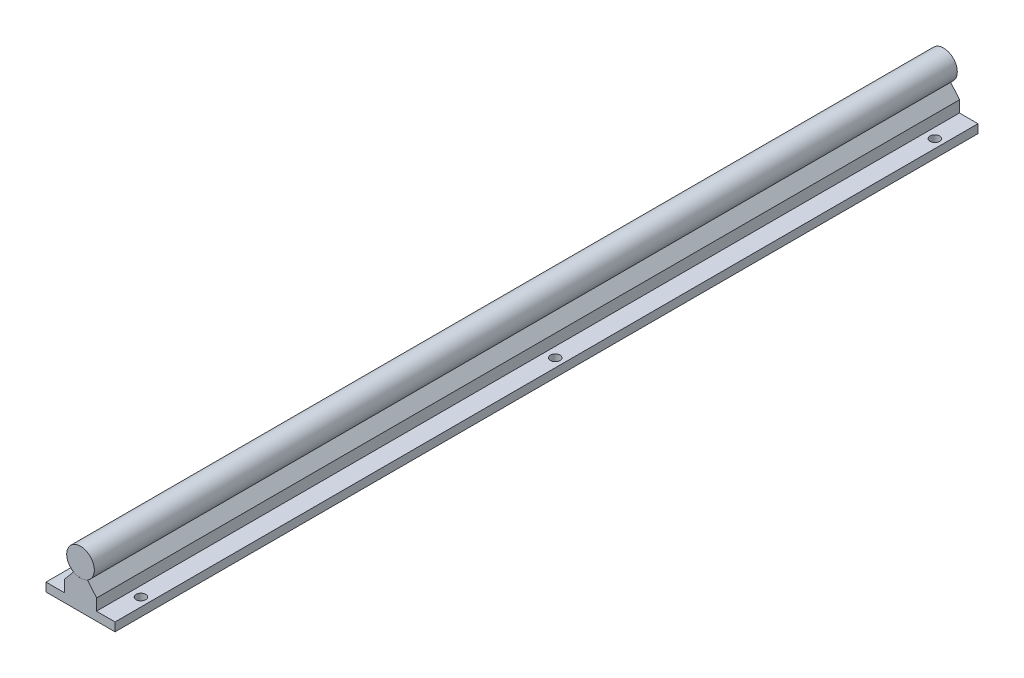
ISO-10303-21;
HEADER;
FILE_DESCRIPTION(('STEP AP214'),'2;1');
FILE_NAME('part.step','',(''),(''),'','','');
FILE_SCHEMA(('AUTOMOTIVE_DESIGN { 1 0 10303 214 1 1 1 1 }'));
ENDSEC;
DATA;
#1=APPLICATION_CONTEXT('core data for automotive mechanical design processes');
#2=APPLICATION_PROTOCOL_DEFINITION('international standard','automotive_design',2000,#1);
#3=PRODUCT_CONTEXT('',#1,'mechanical');
#4=PRODUCT('Part','Part','',(#3));
#5=PRODUCT_RELATED_PRODUCT_CATEGORY('part','',(#4));
#6=PRODUCT_DEFINITION_FORMATION('','',#4);
#7=PRODUCT_DEFINITION_CONTEXT('part definition',#1,'design');
#8=PRODUCT_DEFINITION('design','',#6,#7);
#9=PRODUCT_DEFINITION_SHAPE('','',#8);
#10=(LENGTH_UNIT() NAMED_UNIT(*) SI_UNIT(.MILLI.,.METRE.));
#11=(NAMED_UNIT(*) PLANE_ANGLE_UNIT() SI_UNIT($,.RADIAN.));
#12=(NAMED_UNIT(*) SI_UNIT($,.STERADIAN.) SOLID_ANGLE_UNIT());
#13=UNCERTAINTY_MEASURE_WITH_UNIT(LENGTH_MEASURE(1.E-05),#10,'distance_accuracy_value','');
#14=(GEOMETRIC_REPRESENTATION_CONTEXT(3) GLOBAL_UNCERTAINTY_ASSIGNED_CONTEXT((#13)) GLOBAL_UNIT_ASSIGNED_CONTEXT((#10,
#11,#12)) REPRESENTATION_CONTEXT('',''));
#15=CARTESIAN_POINT('',(0.,0.,0.));
#16=DIRECTION('',(0.,0.,1.));
#17=DIRECTION('',(1.,0.,0.));
#18=AXIS2_PLACEMENT_3D('',#15,#16,#17);
#19=CARTESIAN_POINT('',(1.29091350120477E-13,-1.82545695673485,500.));
#20=DIRECTION('',(0.,0.,-1.));
#21=DIRECTION('',(1.,0.,0.));
#22=AXIS2_PLACEMENT_3D('',#19,#20,#21);
#23=CYLINDRICAL_SURFACE('',#22,8.00000000000048);
#24=CARTESIAN_POINT('',(1.29091350120477E-13,-1.82545695673485,0.));
#25=DIRECTION('',(0.,0.,1.));
#26=DIRECTION('',(-1.,0.,0.));
#27=AXIS2_PLACEMENT_3D('',#24,#25,#26);
#28=CIRCLE('',#27,8.00000000000048);
#29=CARTESIAN_POINT('',(-4.,-8.75366018701084,0.));
#30=VERTEX_POINT('',#29);
#31=CARTESIAN_POINT('',(4.,-8.75366018701084,0.));
#32=VERTEX_POINT('',#31);
#33=EDGE_CURVE('E130',#30,#32,#28,.T.);
#34=ORIENTED_EDGE('',*,*,#33,.F.);
#35=DIRECTION('',(0.,0.,-1.));
#36=VECTOR('',#35,1.);
#37=CARTESIAN_POINT('',(-4.,-8.75366018701084,500.));
#38=LINE('',#37,#36);
#39=CARTESIAN_POINT('',(-4.,-8.75366018701084,500.));
#40=VERTEX_POINT('',#39);
#41=EDGE_CURVE('E129',#40,#30,#38,.T.);
#42=ORIENTED_EDGE('',*,*,#41,.F.);
#43=CARTESIAN_POINT('',(1.29091350120477E-13,-1.82545695673485,500.));
#44=DIRECTION('',(0.,0.,1.));
#45=DIRECTION('',(-1.,0.,0.));
#46=AXIS2_PLACEMENT_3D('',#43,#44,#45);
#47=CIRCLE('',#46,8.00000000000048);
#48=CARTESIAN_POINT('',(4.,-8.75366018701084,500.));
#49=VERTEX_POINT('',#48);
#50=EDGE_CURVE('E146',#40,#49,#47,.T.);
#51=ORIENTED_EDGE('',*,*,#50,.T.);
#52=DIRECTION('',(0.,0.,-1.));
#53=VECTOR('',#52,1.);
#54=CARTESIAN_POINT('',(4.,-8.75366018701084,500.));
#55=LINE('',#54,#53);
#56=EDGE_CURVE('E231',#49,#32,#55,.T.);
#57=ORIENTED_EDGE('',*,*,#56,.T.);
#58=EDGE_LOOP('',(#34,#42,#51,#57));
#59=FACE_BOUND('',#58,.T.);
#60=ADVANCED_FACE('F42',(#59),#23,.F.);
#61=CARTESIAN_POINT('',(-20.,-26.8254569567353,500.));
#62=DIRECTION('',(0.,1.,0.));
#63=DIRECTION('',(1.,0.,0.));
#64=AXIS2_PLACEMENT_3D('',#61,#62,#63);
#65=PLANE('',#64);
#66=CARTESIAN_POINT('',(15.,-26.8254569567353,480.));
#67=DIRECTION('',(0.,-1.,0.));
#68=DIRECTION('',(1.,0.,0.));
#69=AXIS2_PLACEMENT_3D('',#66,#67,#68);
#70=CIRCLE('',#69,2.75);
#71=CARTESIAN_POINT('',(17.75,-26.8254569567353,480.));
#72=VERTEX_POINT('',#71);
#73=EDGE_CURVE('E290',#72,#72,#70,.T.);
#74=ORIENTED_EDGE('',*,*,#73,.F.);
#75=EDGE_LOOP('',(#74));
#76=FACE_BOUND('',#75,.T.);
#77=CARTESIAN_POINT('',(-15.,-26.8254569567353,480.));
#78=DIRECTION('',(0.,-1.,0.));
#79=DIRECTION('',(1.,0.,0.));
#80=AXIS2_PLACEMENT_3D('',#77,#78,#79);
#81=CIRCLE('',#80,2.75);
#82=CARTESIAN_POINT('',(-12.25,-26.8254569567353,480.));
#83=VERTEX_POINT('',#82);
#84=EDGE_CURVE('E284',#83,#83,#81,.T.);
#85=ORIENTED_EDGE('',*,*,#84,.F.);
#86=EDGE_LOOP('',(#85));
#87=FACE_BOUND('',#86,.T.);
#88=CARTESIAN_POINT('',(15.,-26.8254569567353,239.937905991553));
#89=DIRECTION('',(0.,-1.,0.));
#90=DIRECTION('',(1.,0.,0.));
#91=AXIS2_PLACEMENT_3D('',#88,#89,#90);
#92=CIRCLE('',#91,2.75);
#93=CARTESIAN_POINT('',(17.75,-26.8254569567353,239.937905991553));
#94=VERTEX_POINT('',#93);
#95=EDGE_CURVE('E278',#94,#94,#92,.T.);
#96=ORIENTED_EDGE('',*,*,#95,.F.);
#97=EDGE_LOOP('',(#96));
#98=FACE_BOUND('',#97,.T.);
#99=CARTESIAN_POINT('',(-15.,-26.8254569567353,239.937905991553));
#100=DIRECTION('',(0.,-1.,0.));
#101=DIRECTION('',(1.,0.,0.));
#102=AXIS2_PLACEMENT_3D('',#99,#100,#101);
#103=CIRCLE('',#102,2.75);
#104=CARTESIAN_POINT('',(-12.25,-26.8254569567353,239.937905991553));
#105=VERTEX_POINT('',#104);
#106=EDGE_CURVE('E272',#105,#105,#103,.T.);
#107=ORIENTED_EDGE('',*,*,#106,.F.);
#108=EDGE_LOOP('',(#107));
#109=FACE_BOUND('',#108,.T.);
#110=CARTESIAN_POINT('',(15.,-26.8254569567353,20.));
#111=DIRECTION('',(0.,-1.,0.));
#112=DIRECTION('',(1.,0.,0.));
#113=AXIS2_PLACEMENT_3D('',#110,#111,#112);
#114=CIRCLE('',#113,2.75);
#115=CARTESIAN_POINT('',(17.75,-26.8254569567353,20.));
#116=VERTEX_POINT('',#115);
#117=EDGE_CURVE('E266',#116,#116,#114,.T.);
#118=ORIENTED_EDGE('',*,*,#117,.F.);
#119=EDGE_LOOP('',(#118));
#120=FACE_BOUND('',#119,.T.);
#121=CARTESIAN_POINT('',(-15.,-26.8254569567353,20.));
#122=DIRECTION('',(0.,-1.,0.));
#123=DIRECTION('',(1.,0.,0.));
#124=AXIS2_PLACEMENT_3D('',#121,#122,#123);
#125=CIRCLE('',#124,2.75);
#126=CARTESIAN_POINT('',(-12.25,-26.8254569567353,20.));
#127=VERTEX_POINT('',#126);
#128=EDGE_CURVE('E260',#127,#127,#125,.T.);
#129=ORIENTED_EDGE('',*,*,#128,.F.);
#130=EDGE_LOOP('',(#129));
#131=FACE_BOUND('',#130,.T.);
#132=DIRECTION('',(-1.,0.,0.));
#133=VECTOR('',#132,1.);
#134=CARTESIAN_POINT('',(-20.,-26.8254569567353,0.));
#135=LINE('',#134,#133);
#136=CARTESIAN_POINT('',(20.,-26.8254569567353,0.));
#137=VERTEX_POINT('',#136);
#138=CARTESIAN_POINT('',(-20.,-26.8254569567353,0.));
#139=VERTEX_POINT('',#138);
#140=EDGE_CURVE('E132',#137,#139,#135,.T.);
#141=ORIENTED_EDGE('',*,*,#140,.F.);
#142=DIRECTION('',(0.,0.,-1.));
#143=VECTOR('',#142,1.);
#144=CARTESIAN_POINT('',(20.,-26.8254569567353,500.));
#145=LINE('',#144,#143);
#146=CARTESIAN_POINT('',(20.,-26.8254569567353,500.));
#147=VERTEX_POINT('',#146);
#148=EDGE_CURVE('E133',#147,#137,#145,.T.);
#149=ORIENTED_EDGE('',*,*,#148,.F.);
#150=DIRECTION('',(-1.,0.,0.));
#151=VECTOR('',#150,1.);
#152=CARTESIAN_POINT('',(-20.,-26.8254569567353,500.));
#153=LINE('',#152,#151);
#154=CARTESIAN_POINT('',(-20.,-26.8254569567353,500.));
#155=VERTEX_POINT('',#154);
#156=EDGE_CURVE('E184',#147,#155,#153,.T.);
#157=ORIENTED_EDGE('',*,*,#156,.T.);
#158=DIRECTION('',(0.,0.,-1.));
#159=VECTOR('',#158,1.);
#160=CARTESIAN_POINT('',(-20.,-26.8254569567353,500.));
#161=LINE('',#160,#159);
#162=EDGE_CURVE('E12',#155,#139,#161,.T.);
#163=ORIENTED_EDGE('',*,*,#162,.T.);
#164=EDGE_LOOP('',(#141,#149,#157,#163));
#165=FACE_BOUND('',#164,.T.);
#166=ADVANCED_FACE('F164',(#76,#87,#98,#109,#120,#131,#165),#65,.F.);
#167=CARTESIAN_POINT('',(-20.,-21.8254569567353,500.));
#168=DIRECTION('',(1.,0.,0.));
#169=DIRECTION('',(0.,-1.,0.));
#170=AXIS2_PLACEMENT_3D('',#167,#168,#169);
#171=PLANE('',#170);
#172=DIRECTION('',(0.,1.,0.));
#173=VECTOR('',#172,1.);
#174=CARTESIAN_POINT('',(-20.,-21.8254569567353,0.));
#175=LINE('',#174,#173);
#176=CARTESIAN_POINT('',(-20.,-21.8254569567353,0.));
#177=VERTEX_POINT('',#176);
#178=EDGE_CURVE('E136',#139,#177,#175,.T.);
#179=ORIENTED_EDGE('',*,*,#178,.F.);
#180=ORIENTED_EDGE('',*,*,#162,.F.);
#181=DIRECTION('',(0.,1.,0.));
#182=VECTOR('',#181,1.);
#183=CARTESIAN_POINT('',(-20.,-21.8254569567353,500.));
#184=LINE('',#183,#182);
#185=CARTESIAN_POINT('',(-20.,-21.8254569567353,500.));
#186=VERTEX_POINT('',#185);
#187=EDGE_CURVE('E92',#155,#186,#184,.T.);
#188=ORIENTED_EDGE('',*,*,#187,.T.);
#189=DIRECTION('',(0.,0.,-1.));
#190=VECTOR('',#189,1.);
#191=CARTESIAN_POINT('',(-20.,-21.8254569567353,500.));
#192=LINE('',#191,#190);
#193=EDGE_CURVE('E50',#186,#177,#192,.T.);
#194=ORIENTED_EDGE('',*,*,#193,.T.);
#195=EDGE_LOOP('',(#179,#180,#188,#194));
#196=FACE_BOUND('',#195,.T.);
#197=ADVANCED_FACE('F152',(#196),#171,.F.);
#198=CARTESIAN_POINT('',(-9.24999999999999,-21.8254569567353,500.));
#199=DIRECTION('',(0.,-1.,0.));
#200=DIRECTION('',(0.,0.,-1.));
#201=AXIS2_PLACEMENT_3D('',#198,#199,#200);
#202=PLANE('',#201);
#203=CARTESIAN_POINT('',(-15.,-21.8254569567353,480.));
#204=DIRECTION('',(0.,-1.,0.));
#205=DIRECTION('',(1.,0.,0.));
#206=AXIS2_PLACEMENT_3D('',#203,#204,#205);
#207=CIRCLE('',#206,2.75);
#208=CARTESIAN_POINT('',(-12.25,-21.8254569567353,480.));
#209=VERTEX_POINT('',#208);
#210=EDGE_CURVE('E281',#209,#209,#207,.F.);
#211=ORIENTED_EDGE('',*,*,#210,.F.);
#212=EDGE_LOOP('',(#211));
#213=FACE_BOUND('',#212,.T.);
#214=CARTESIAN_POINT('',(-15.,-21.8254569567353,239.937905991553));
#215=DIRECTION('',(0.,-1.,0.));
#216=DIRECTION('',(1.,0.,0.));
#217=AXIS2_PLACEMENT_3D('',#214,#215,#216);
#218=CIRCLE('',#217,2.75);
#219=CARTESIAN_POINT('',(-12.25,-21.8254569567353,239.937905991553));
#220=VERTEX_POINT('',#219);
#221=EDGE_CURVE('E269',#220,#220,#218,.F.);
#222=ORIENTED_EDGE('',*,*,#221,.F.);
#223=EDGE_LOOP('',(#222));
#224=FACE_BOUND('',#223,.T.);
#225=CARTESIAN_POINT('',(-15.,-21.8254569567353,20.));
#226=DIRECTION('',(0.,-1.,0.));
#227=DIRECTION('',(1.,0.,0.));
#228=AXIS2_PLACEMENT_3D('',#225,#226,#227);
#229=CIRCLE('',#228,2.75);
#230=CARTESIAN_POINT('',(-12.25,-21.8254569567353,20.));
#231=VERTEX_POINT('',#230);
#232=EDGE_CURVE('E252',#231,#231,#229,.F.);
#233=ORIENTED_EDGE('',*,*,#232,.F.);
#234=EDGE_LOOP('',(#233));
#235=FACE_BOUND('',#234,.T.);
#236=DIRECTION('',(1.,0.,0.));
#237=VECTOR('',#236,1.);
#238=CARTESIAN_POINT('',(-9.24999999999999,-21.8254569567353,0.));
#239=LINE('',#238,#237);
#240=CARTESIAN_POINT('',(-9.24999999999999,-21.8254569567353,0.));
#241=VERTEX_POINT('',#240);
#242=EDGE_CURVE('E139',#177,#241,#239,.T.);
#243=ORIENTED_EDGE('',*,*,#242,.F.);
#244=ORIENTED_EDGE('',*,*,#193,.F.);
#245=DIRECTION('',(1.,0.,0.));
#246=VECTOR('',#245,1.);
#247=CARTESIAN_POINT('',(-9.24999999999999,-21.8254569567353,500.));
#248=LINE('',#247,#246);
#249=CARTESIAN_POINT('',(-9.24999999999999,-21.8254569567353,500.));
#250=VERTEX_POINT('',#249);
#251=EDGE_CURVE('E123',#186,#250,#248,.T.);
#252=ORIENTED_EDGE('',*,*,#251,.T.);
#253=DIRECTION('',(0.,0.,-1.));
#254=VECTOR('',#253,1.);
#255=CARTESIAN_POINT('',(-9.24999999999999,-21.8254569567353,500.));
#256=LINE('',#255,#254);
#257=EDGE_CURVE('E117',#250,#241,#256,.T.);
#258=ORIENTED_EDGE('',*,*,#257,.T.);
#259=EDGE_LOOP('',(#243,#244,#252,#258));
#260=FACE_BOUND('',#259,.T.);
#261=ADVANCED_FACE('F316',(#213,#224,#235,#260),#202,.F.);
#262=CARTESIAN_POINT('',(-9.25,-15.1254569567353,500.));
#263=DIRECTION('',(1.,0.,0.));
#264=DIRECTION('',(0.,0.,1.));
#265=AXIS2_PLACEMENT_3D('',#262,#263,#264);
#266=PLANE('',#265);
#267=DIRECTION('',(0.,1.,0.));
#268=VECTOR('',#267,1.);
#269=CARTESIAN_POINT('',(-9.25,-15.1254569567353,0.));
#270=LINE('',#269,#268);
#271=CARTESIAN_POINT('',(-9.25,-15.1254569567353,0.));
#272=VERTEX_POINT('',#271);
#273=EDGE_CURVE('E142',#241,#272,#270,.T.);
#274=ORIENTED_EDGE('',*,*,#273,.F.);
#275=ORIENTED_EDGE('',*,*,#257,.F.);
#276=DIRECTION('',(0.,1.,0.));
#277=VECTOR('',#276,1.);
#278=CARTESIAN_POINT('',(-9.25,-15.1254569567353,500.));
#279=LINE('',#278,#277);
#280=CARTESIAN_POINT('',(-9.25,-15.1254569567353,500.));
#281=VERTEX_POINT('',#280);
#282=EDGE_CURVE('E107',#250,#281,#279,.T.);
#283=ORIENTED_EDGE('',*,*,#282,.T.);
#284=DIRECTION('',(0.,0.,-1.));
#285=VECTOR('',#284,1.);
#286=CARTESIAN_POINT('',(-9.25,-15.1254569567353,500.));
#287=LINE('',#286,#285);
#288=EDGE_CURVE('E112',#281,#272,#287,.T.);
#289=ORIENTED_EDGE('',*,*,#288,.T.);
#290=EDGE_LOOP('',(#274,#275,#283,#289));
#291=FACE_BOUND('',#290,.T.);
#292=ADVANCED_FACE('F120',(#291),#266,.F.);
#293=CARTESIAN_POINT('',(-9.34657231941235,-15.1254569567353,500.));
#294=DIRECTION('',(0.,1.,0.));
#295=DIRECTION('',(0.,0.,1.));
#296=AXIS2_PLACEMENT_3D('',#293,#294,#295);
#297=PLANE('',#296);
#298=DIRECTION('',(-1.,0.,0.));
#299=VECTOR('',#298,1.);
#300=CARTESIAN_POINT('',(-9.34657231941235,-15.1254569567353,0.));
#301=LINE('',#300,#299);
#302=CARTESIAN_POINT('',(-9.34657231941235,-15.1254569567353,0.));
#303=VERTEX_POINT('',#302);
#304=EDGE_CURVE('E114',#272,#303,#301,.T.);
#305=ORIENTED_EDGE('',*,*,#304,.F.);
#306=ORIENTED_EDGE('',*,*,#288,.F.);
#307=DIRECTION('',(-1.,0.,0.));
#308=VECTOR('',#307,1.);
#309=CARTESIAN_POINT('',(-9.34657231941235,-15.1254569567353,500.));
#310=LINE('',#309,#308);
#311=CARTESIAN_POINT('',(-9.34657231941235,-15.1254569567353,500.));
#312=VERTEX_POINT('',#311);
#313=EDGE_CURVE('E103',#281,#312,#310,.T.);
#314=ORIENTED_EDGE('',*,*,#313,.T.);
#315=DIRECTION('',(0.,0.,-1.));
#316=VECTOR('',#315,1.);
#317=CARTESIAN_POINT('',(-9.34657231941235,-15.1254569567353,500.));
#318=LINE('',#317,#316);
#319=EDGE_CURVE('E118',#312,#303,#318,.T.);
#320=ORIENTED_EDGE('',*,*,#319,.T.);
#321=EDGE_LOOP('',(#305,#306,#314,#320));
#322=FACE_BOUND('',#321,.T.);
#323=ADVANCED_FACE('F113',(#322),#297,.F.);
#324=CARTESIAN_POINT('',(-4.,-8.75366018701084,500.));
#325=DIRECTION('',(0.766044443118982,-0.642787609686535,0.));
#326=DIRECTION('',(-0.642787609686535,-0.766044443118982,0.));
#327=AXIS2_PLACEMENT_3D('',#324,#325,#326);
#328=PLANE('',#327);
#329=DIRECTION('',(0.642787609686535,0.766044443118982,0.));
#330=VECTOR('',#329,1.);
#331=CARTESIAN_POINT('',(-4.,-8.75366018701084,0.));
#332=LINE('',#331,#330);
#333=EDGE_CURVE('E79',#303,#30,#332,.T.);
#334=ORIENTED_EDGE('',*,*,#333,.F.);
#335=ORIENTED_EDGE('',*,*,#319,.F.);
#336=DIRECTION('',(0.642787609686535,0.766044443118982,0.));
#337=VECTOR('',#336,1.);
#338=CARTESIAN_POINT('',(-4.,-8.75366018701084,500.));
#339=LINE('',#338,#337);
#340=EDGE_CURVE('E58',#312,#40,#339,.T.);
#341=ORIENTED_EDGE('',*,*,#340,.T.);
#342=ORIENTED_EDGE('',*,*,#41,.T.);
#343=EDGE_LOOP('',(#334,#335,#341,#342));
#344=FACE_BOUND('',#343,.T.);
#345=ADVANCED_FACE('F349',(#344),#328,.F.);
#346=CARTESIAN_POINT('',(1.29091350120477E-13,-1.82545695673485,500.));
#347=DIRECTION('',(0.,0.,1.));
#348=DIRECTION('',(-1.,0.,0.));
#349=AXIS2_PLACEMENT_3D('',#346,#347,#348);
#350=PLANE('',#349);
#351=ORIENTED_EDGE('',*,*,#50,.F.);
#352=ORIENTED_EDGE('',*,*,#340,.F.);
#353=ORIENTED_EDGE('',*,*,#313,.F.);
#354=ORIENTED_EDGE('',*,*,#282,.F.);
#355=ORIENTED_EDGE('',*,*,#251,.F.);
#356=ORIENTED_EDGE('',*,*,#187,.F.);
#357=ORIENTED_EDGE('',*,*,#156,.F.);
#358=DIRECTION('',(0.,1.,0.));
#359=VECTOR('',#358,1.);
#360=CARTESIAN_POINT('',(20.,-21.8254569567353,500.));
#361=LINE('',#360,#359);
#362=CARTESIAN_POINT('',(20.,-21.8254569567353,500.));
#363=VERTEX_POINT('',#362);
#364=EDGE_CURVE('E175',#147,#363,#361,.T.);
#365=ORIENTED_EDGE('',*,*,#364,.T.);
#366=DIRECTION('',(-1.,0.,0.));
#367=VECTOR('',#366,1.);
#368=CARTESIAN_POINT('',(9.25,-21.8254569567353,500.));
#369=LINE('',#368,#367);
#370=CARTESIAN_POINT('',(9.25,-21.8254569567353,500.));
#371=VERTEX_POINT('',#370);
#372=EDGE_CURVE('E235',#363,#371,#369,.T.);
#373=ORIENTED_EDGE('',*,*,#372,.T.);
#374=DIRECTION('',(0.,1.,0.));
#375=VECTOR('',#374,1.);
#376=CARTESIAN_POINT('',(9.25,-15.1254569567353,500.));
#377=LINE('',#376,#375);
#378=CARTESIAN_POINT('',(9.25,-15.1254569567353,500.));
#379=VERTEX_POINT('',#378);
#380=EDGE_CURVE('E245',#371,#379,#377,.T.);
#381=ORIENTED_EDGE('',*,*,#380,.T.);
#382=DIRECTION('',(1.,0.,0.));
#383=VECTOR('',#382,1.);
#384=CARTESIAN_POINT('',(9.34657231941235,-15.1254569567353,500.));
#385=LINE('',#384,#383);
#386=CARTESIAN_POINT('',(9.34657231941235,-15.1254569567353,500.));
#387=VERTEX_POINT('',#386);
#388=EDGE_CURVE('E254',#379,#387,#385,.T.);
#389=ORIENTED_EDGE('',*,*,#388,.T.);
#390=DIRECTION('',(-0.642787609686535,0.766044443118982,0.));
#391=VECTOR('',#390,1.);
#392=CARTESIAN_POINT('',(4.,-8.75366018701084,500.));
#393=LINE('',#392,#391);
#394=EDGE_CURVE('E230',#387,#49,#393,.T.);
#395=ORIENTED_EDGE('',*,*,#394,.T.);
#396=EDGE_LOOP('',(#351,#352,#353,#354,#355,#356,#357,#365,#373,#381,#389,#395));
#397=FACE_BOUND('',#396,.T.);
#398=ADVANCED_FACE('F105',(#397),#350,.T.);
#399=CARTESIAN_POINT('',(1.29091350120477E-13,-1.82545695673485,0.));
#400=DIRECTION('',(0.,0.,1.));
#401=DIRECTION('',(-1.,0.,0.));
#402=AXIS2_PLACEMENT_3D('',#399,#400,#401);
#403=PLANE('',#402);
#404=ORIENTED_EDGE('',*,*,#33,.T.);
#405=DIRECTION('',(-0.642787609686535,0.766044443118982,0.));
#406=VECTOR('',#405,1.);
#407=CARTESIAN_POINT('',(4.,-8.75366018701084,0.));
#408=LINE('',#407,#406);
#409=CARTESIAN_POINT('',(9.34657231941235,-15.1254569567353,0.));
#410=VERTEX_POINT('',#409);
#411=EDGE_CURVE('E221',#410,#32,#408,.T.);
#412=ORIENTED_EDGE('',*,*,#411,.F.);
#413=DIRECTION('',(1.,0.,0.));
#414=VECTOR('',#413,1.);
#415=CARTESIAN_POINT('',(9.34657231941235,-15.1254569567353,0.));
#416=LINE('',#415,#414);
#417=CARTESIAN_POINT('',(9.25,-15.1254569567353,0.));
#418=VERTEX_POINT('',#417);
#419=EDGE_CURVE('E211',#418,#410,#416,.T.);
#420=ORIENTED_EDGE('',*,*,#419,.F.);
#421=DIRECTION('',(0.,1.,0.));
#422=VECTOR('',#421,1.);
#423=CARTESIAN_POINT('',(9.25,-15.1254569567353,0.));
#424=LINE('',#423,#422);
#425=CARTESIAN_POINT('',(9.25,-21.8254569567353,0.));
#426=VERTEX_POINT('',#425);
#427=EDGE_CURVE('E222',#426,#418,#424,.T.);
#428=ORIENTED_EDGE('',*,*,#427,.F.);
#429=DIRECTION('',(-1.,0.,0.));
#430=VECTOR('',#429,1.);
#431=CARTESIAN_POINT('',(9.25,-21.8254569567353,0.));
#432=LINE('',#431,#430);
#433=CARTESIAN_POINT('',(20.,-21.8254569567353,0.));
#434=VERTEX_POINT('',#433);
#435=EDGE_CURVE('E248',#434,#426,#432,.T.);
#436=ORIENTED_EDGE('',*,*,#435,.F.);
#437=DIRECTION('',(0.,1.,0.));
#438=VECTOR('',#437,1.);
#439=CARTESIAN_POINT('',(20.,-21.8254569567353,0.));
#440=LINE('',#439,#438);
#441=EDGE_CURVE('E160',#137,#434,#440,.T.);
#442=ORIENTED_EDGE('',*,*,#441,.F.);
#443=ORIENTED_EDGE('',*,*,#140,.T.);
#444=ORIENTED_EDGE('',*,*,#178,.T.);
#445=ORIENTED_EDGE('',*,*,#242,.T.);
#446=ORIENTED_EDGE('',*,*,#273,.T.);
#447=ORIENTED_EDGE('',*,*,#304,.T.);
#448=ORIENTED_EDGE('',*,*,#333,.T.);
#449=EDGE_LOOP('',(#404,#412,#420,#428,#436,#442,#443,#444,#445,#446,#447,#448));
#450=FACE_BOUND('',#449,.T.);
#451=ADVANCED_FACE('F154',(#450),#403,.F.);
#452=CARTESIAN_POINT('',(20.,-21.8254569567353,500.));
#453=DIRECTION('',(-1.,0.,0.));
#454=DIRECTION('',(0.,-1.,0.));
#455=AXIS2_PLACEMENT_3D('',#452,#453,#454);
#456=PLANE('',#455);
#457=ORIENTED_EDGE('',*,*,#441,.T.);
#458=DIRECTION('',(0.,0.,-1.));
#459=VECTOR('',#458,1.);
#460=CARTESIAN_POINT('',(20.,-21.8254569567353,500.));
#461=LINE('',#460,#459);
#462=EDGE_CURVE('E176',#363,#434,#461,.T.);
#463=ORIENTED_EDGE('',*,*,#462,.F.);
#464=ORIENTED_EDGE('',*,*,#364,.F.);
#465=ORIENTED_EDGE('',*,*,#148,.T.);
#466=EDGE_LOOP('',(#457,#463,#464,#465));
#467=FACE_BOUND('',#466,.T.);
#468=ADVANCED_FACE('F171',(#467),#456,.F.);
#469=CARTESIAN_POINT('',(9.25,-21.8254569567353,500.));
#470=DIRECTION('',(0.,-1.,0.));
#471=DIRECTION('',(0.,0.,-1.));
#472=AXIS2_PLACEMENT_3D('',#469,#470,#471);
#473=PLANE('',#472);
#474=CARTESIAN_POINT('',(15.,-21.8254569567353,480.));
#475=DIRECTION('',(0.,-1.,0.));
#476=DIRECTION('',(0.,0.,-1.));
#477=AXIS2_PLACEMENT_3D('',#474,#475,#476);
#478=CIRCLE('',#477,2.75);
#479=CARTESIAN_POINT('',(15.,-21.8254569567353,477.25));
#480=VERTEX_POINT('',#479);
#481=EDGE_CURVE('E287',#480,#480,#478,.F.);
#482=ORIENTED_EDGE('',*,*,#481,.F.);
#483=EDGE_LOOP('',(#482));
#484=FACE_BOUND('',#483,.T.);
#485=CARTESIAN_POINT('',(15.,-21.8254569567353,239.937905991553));
#486=DIRECTION('',(0.,-1.,0.));
#487=DIRECTION('',(0.,0.,-1.));
#488=AXIS2_PLACEMENT_3D('',#485,#486,#487);
#489=CIRCLE('',#488,2.75);
#490=CARTESIAN_POINT('',(15.,-21.8254569567353,237.187905991553));
#491=VERTEX_POINT('',#490);
#492=EDGE_CURVE('E275',#491,#491,#489,.F.);
#493=ORIENTED_EDGE('',*,*,#492,.F.);
#494=EDGE_LOOP('',(#493));
#495=FACE_BOUND('',#494,.T.);
#496=CARTESIAN_POINT('',(15.,-21.8254569567353,20.));
#497=DIRECTION('',(0.,-1.,0.));
#498=DIRECTION('',(0.,0.,-1.));
#499=AXIS2_PLACEMENT_3D('',#496,#497,#498);
#500=CIRCLE('',#499,2.75);
#501=CARTESIAN_POINT('',(15.,-21.8254569567353,17.25));
#502=VERTEX_POINT('',#501);
#503=EDGE_CURVE('E263',#502,#502,#500,.F.);
#504=ORIENTED_EDGE('',*,*,#503,.F.);
#505=EDGE_LOOP('',(#504));
#506=FACE_BOUND('',#505,.T.);
#507=ORIENTED_EDGE('',*,*,#435,.T.);
#508=DIRECTION('',(0.,0.,-1.));
#509=VECTOR('',#508,1.);
#510=CARTESIAN_POINT('',(9.25,-21.8254569567353,500.));
#511=LINE('',#510,#509);
#512=EDGE_CURVE('E178',#371,#426,#511,.T.);
#513=ORIENTED_EDGE('',*,*,#512,.F.);
#514=ORIENTED_EDGE('',*,*,#372,.F.);
#515=ORIENTED_EDGE('',*,*,#462,.T.);
#516=EDGE_LOOP('',(#507,#513,#514,#515));
#517=FACE_BOUND('',#516,.T.);
#518=ADVANCED_FACE('F333',(#484,#495,#506,#517),#473,.F.);
#519=CARTESIAN_POINT('',(9.25,-15.1254569567353,500.));
#520=DIRECTION('',(-1.,0.,0.));
#521=DIRECTION('',(0.,0.,1.));
#522=AXIS2_PLACEMENT_3D('',#519,#520,#521);
#523=PLANE('',#522);
#524=ORIENTED_EDGE('',*,*,#427,.T.);
#525=DIRECTION('',(0.,0.,-1.));
#526=VECTOR('',#525,1.);
#527=CARTESIAN_POINT('',(9.25,-15.1254569567353,500.));
#528=LINE('',#527,#526);
#529=EDGE_CURVE('E218',#379,#418,#528,.T.);
#530=ORIENTED_EDGE('',*,*,#529,.F.);
#531=ORIENTED_EDGE('',*,*,#380,.F.);
#532=ORIENTED_EDGE('',*,*,#512,.T.);
#533=EDGE_LOOP('',(#524,#530,#531,#532));
#534=FACE_BOUND('',#533,.T.);
#535=ADVANCED_FACE('F244',(#534),#523,.F.);
#536=CARTESIAN_POINT('',(9.34657231941235,-15.1254569567353,500.));
#537=DIRECTION('',(0.,1.,0.));
#538=DIRECTION('',(0.,0.,1.));
#539=AXIS2_PLACEMENT_3D('',#536,#537,#538);
#540=PLANE('',#539);
#541=ORIENTED_EDGE('',*,*,#419,.T.);
#542=DIRECTION('',(0.,0.,-1.));
#543=VECTOR('',#542,1.);
#544=CARTESIAN_POINT('',(9.34657231941235,-15.1254569567353,500.));
#545=LINE('',#544,#543);
#546=EDGE_CURVE('E215',#387,#410,#545,.T.);
#547=ORIENTED_EDGE('',*,*,#546,.F.);
#548=ORIENTED_EDGE('',*,*,#388,.F.);
#549=ORIENTED_EDGE('',*,*,#529,.T.);
#550=EDGE_LOOP('',(#541,#547,#548,#549));
#551=FACE_BOUND('',#550,.T.);
#552=ADVANCED_FACE('F213',(#551),#540,.F.);
#553=CARTESIAN_POINT('',(4.,-8.75366018701084,500.));
#554=DIRECTION('',(-0.766044443118982,-0.642787609686535,0.));
#555=DIRECTION('',(0.642787609686535,-0.766044443118982,0.));
#556=AXIS2_PLACEMENT_3D('',#553,#554,#555);
#557=PLANE('',#556);
#558=ORIENTED_EDGE('',*,*,#411,.T.);
#559=ORIENTED_EDGE('',*,*,#56,.F.);
#560=ORIENTED_EDGE('',*,*,#394,.F.);
#561=ORIENTED_EDGE('',*,*,#546,.T.);
#562=EDGE_LOOP('',(#558,#559,#560,#561));
#563=FACE_BOUND('',#562,.T.);
#564=ADVANCED_FACE('F226',(#563),#557,.F.);
#565=CARTESIAN_POINT('',(-15.,6.17554304326466,20.));
#566=DIRECTION('',(0.,-1.,0.));
#567=DIRECTION('',(1.,0.,0.));
#568=AXIS2_PLACEMENT_3D('',#565,#566,#567);
#569=CYLINDRICAL_SURFACE('',#568,2.75);
#570=ORIENTED_EDGE('',*,*,#128,.T.);
#571=EDGE_LOOP('',(#570));
#572=FACE_BOUND('',#571,.T.);
#573=ORIENTED_EDGE('',*,*,#232,.T.);
#574=EDGE_LOOP('',(#573));
#575=FACE_BOUND('',#574,.T.);
#576=ADVANCED_FACE('F309',(#572,#575),#569,.F.);
#577=CARTESIAN_POINT('',(15.,6.17554304326467,20.));
#578=DIRECTION('',(0.,-1.,0.));
#579=DIRECTION('',(1.,0.,0.));
#580=AXIS2_PLACEMENT_3D('',#577,#578,#579);
#581=CYLINDRICAL_SURFACE('',#580,2.75);
#582=ORIENTED_EDGE('',*,*,#117,.T.);
#583=EDGE_LOOP('',(#582));
#584=FACE_BOUND('',#583,.T.);
#585=ORIENTED_EDGE('',*,*,#503,.T.);
#586=EDGE_LOOP('',(#585));
#587=FACE_BOUND('',#586,.T.);
#588=ADVANCED_FACE('F312',(#584,#587),#581,.F.);
#589=CARTESIAN_POINT('',(-15.,6.17554304326466,239.937905991553));
#590=DIRECTION('',(0.,-1.,0.));
#591=DIRECTION('',(1.,0.,0.));
#592=AXIS2_PLACEMENT_3D('',#589,#590,#591);
#593=CYLINDRICAL_SURFACE('',#592,2.75);
#594=ORIENTED_EDGE('',*,*,#106,.T.);
#595=EDGE_LOOP('',(#594));
#596=FACE_BOUND('',#595,.T.);
#597=ORIENTED_EDGE('',*,*,#221,.T.);
#598=EDGE_LOOP('',(#597));
#599=FACE_BOUND('',#598,.T.);
#600=ADVANCED_FACE('F412',(#596,#599),#593,.F.);
#601=CARTESIAN_POINT('',(15.,6.17554304326467,239.937905991553));
#602=DIRECTION('',(0.,-1.,0.));
#603=DIRECTION('',(1.,0.,0.));
#604=AXIS2_PLACEMENT_3D('',#601,#602,#603);
#605=CYLINDRICAL_SURFACE('',#604,2.75);
#606=ORIENTED_EDGE('',*,*,#95,.T.);
#607=EDGE_LOOP('',(#606));
#608=FACE_BOUND('',#607,.T.);
#609=ORIENTED_EDGE('',*,*,#492,.T.);
#610=EDGE_LOOP('',(#609));
#611=FACE_BOUND('',#610,.T.);
#612=ADVANCED_FACE('F420',(#608,#611),#605,.F.);
#613=CARTESIAN_POINT('',(-15.,6.17554304326466,480.));
#614=DIRECTION('',(0.,-1.,0.));
#615=DIRECTION('',(1.,0.,0.));
#616=AXIS2_PLACEMENT_3D('',#613,#614,#615);
#617=CYLINDRICAL_SURFACE('',#616,2.75);
#618=ORIENTED_EDGE('',*,*,#84,.T.);
#619=EDGE_LOOP('',(#618));
#620=FACE_BOUND('',#619,.T.);
#621=ORIENTED_EDGE('',*,*,#210,.T.);
#622=EDGE_LOOP('',(#621));
#623=FACE_BOUND('',#622,.T.);
#624=ADVANCED_FACE('F428',(#620,#623),#617,.F.);
#625=CARTESIAN_POINT('',(15.,6.17554304326467,480.));
#626=DIRECTION('',(0.,-1.,0.));
#627=DIRECTION('',(1.,0.,0.));
#628=AXIS2_PLACEMENT_3D('',#625,#626,#627);
#629=CYLINDRICAL_SURFACE('',#628,2.75);
#630=ORIENTED_EDGE('',*,*,#73,.T.);
#631=EDGE_LOOP('',(#630));
#632=FACE_BOUND('',#631,.T.);
#633=ORIENTED_EDGE('',*,*,#481,.T.);
#634=EDGE_LOOP('',(#633));
#635=FACE_BOUND('',#634,.T.);
#636=ADVANCED_FACE('F294',(#632,#635),#629,.F.);
#637=CLOSED_SHELL('',(#60,#166,#197,#261,#292,#323,#345,#398,#451,#468,#518,#535,#552,#564,#576,
#588,#600,#612,#624,#636));
#638=MANIFOLD_SOLID_BREP('B2',#637);
#639=CARTESIAN_POINT('',(0.,-1.82545695673533,500.));
#640=DIRECTION('',(0.,0.,-1.));
#641=DIRECTION('',(-1.,0.,0.));
#642=AXIS2_PLACEMENT_3D('',#639,#640,#641);
#643=CYLINDRICAL_SURFACE('',#642,8.);
#644=CARTESIAN_POINT('',(0.,-1.82545695673533,500.));
#645=DIRECTION('',(0.,0.,1.));
#646=DIRECTION('',(1.,0.,0.));
#647=AXIS2_PLACEMENT_3D('',#644,#645,#646);
#648=CIRCLE('',#647,8.);
#649=CARTESIAN_POINT('',(8.,-1.82545695673533,500.));
#650=VERTEX_POINT('',#649);
#651=EDGE_CURVE('E41',#650,#650,#648,.T.);
#652=ORIENTED_EDGE('',*,*,#651,.F.);
#653=EDGE_LOOP('',(#652));
#654=FACE_BOUND('',#653,.T.);
#655=CARTESIAN_POINT('',(0.,-1.82545695673533,0.));
#656=DIRECTION('',(0.,0.,1.));
#657=DIRECTION('',(1.,0.,0.));
#658=AXIS2_PLACEMENT_3D('',#655,#656,#657);
#659=CIRCLE('',#658,8.);
#660=CARTESIAN_POINT('',(8.,-1.82545695673533,0.));
#661=VERTEX_POINT('',#660);
#662=EDGE_CURVE('E523',#661,#661,#659,.T.);
#663=ORIENTED_EDGE('',*,*,#662,.T.);
#664=EDGE_LOOP('',(#663));
#665=FACE_BOUND('',#664,.T.);
#666=ADVANCED_FACE('F520',(#654,#665),#643,.T.);
#667=CARTESIAN_POINT('',(0.,-1.82545695673533,500.));
#668=DIRECTION('',(0.,0.,1.));
#669=DIRECTION('',(1.,0.,0.));
#670=AXIS2_PLACEMENT_3D('',#667,#668,#669);
#671=PLANE('',#670);
#672=ORIENTED_EDGE('',*,*,#651,.T.);
#673=EDGE_LOOP('',(#672));
#674=FACE_BOUND('',#673,.T.);
#675=ADVANCED_FACE('F535',(#674),#671,.T.);
#676=CARTESIAN_POINT('',(0.,-1.82545695673533,0.));
#677=DIRECTION('',(0.,0.,1.));
#678=DIRECTION('',(1.,0.,0.));
#679=AXIS2_PLACEMENT_3D('',#676,#677,#678);
#680=PLANE('',#679);
#681=ORIENTED_EDGE('',*,*,#662,.F.);
#682=EDGE_LOOP('',(#681));
#683=FACE_BOUND('',#682,.T.);
#684=ADVANCED_FACE('F533',(#683),#680,.F.);
#685=CLOSED_SHELL('',(#666,#675,#684));
#686=MANIFOLD_SOLID_BREP('B6',#685);
#687=ADVANCED_BREP_SHAPE_REPRESENTATION('',(#18,#638,#686),#14);
#688=SHAPE_DEFINITION_REPRESENTATION(#9,#687);
ENDSEC;
END-ISO-10303-21;
